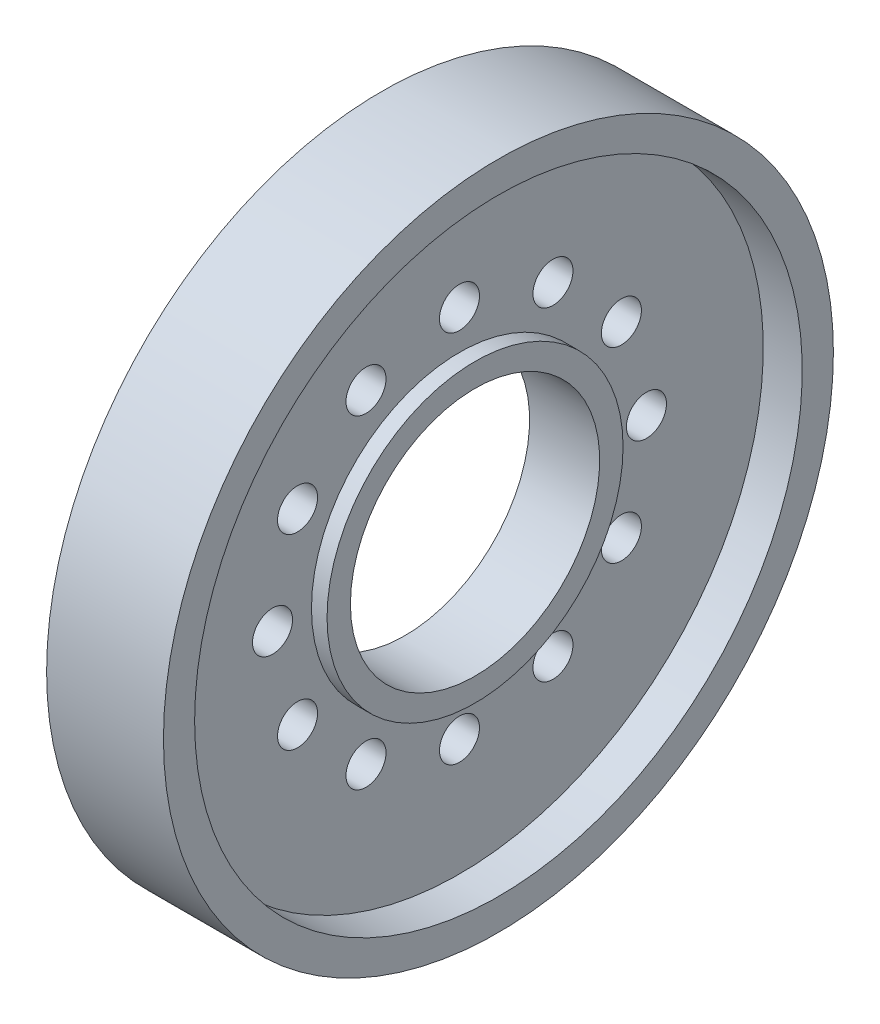
ISO-10303-21;
HEADER;
FILE_DESCRIPTION(('STEP AP214'),'2;1');
FILE_NAME('part.step','',(''),(''),'','','');
FILE_SCHEMA(('AUTOMOTIVE_DESIGN { 1 0 10303 214 1 1 1 1 }'));
ENDSEC;
DATA;
#1=APPLICATION_CONTEXT('core data for automotive mechanical design processes');
#2=APPLICATION_PROTOCOL_DEFINITION('international standard','automotive_design',2000,#1);
#3=PRODUCT_CONTEXT('',#1,'mechanical');
#4=PRODUCT('Part','Part','',(#3));
#5=PRODUCT_RELATED_PRODUCT_CATEGORY('part','',(#4));
#6=PRODUCT_DEFINITION_FORMATION('','',#4);
#7=PRODUCT_DEFINITION_CONTEXT('part definition',#1,'design');
#8=PRODUCT_DEFINITION('design','',#6,#7);
#9=PRODUCT_DEFINITION_SHAPE('','',#8);
#10=(LENGTH_UNIT() NAMED_UNIT(*) SI_UNIT(.MILLI.,.METRE.));
#11=(NAMED_UNIT(*) PLANE_ANGLE_UNIT() SI_UNIT($,.RADIAN.));
#12=(NAMED_UNIT(*) SI_UNIT($,.STERADIAN.) SOLID_ANGLE_UNIT());
#13=UNCERTAINTY_MEASURE_WITH_UNIT(LENGTH_MEASURE(1.E-05),#10,'distance_accuracy_value','');
#14=(GEOMETRIC_REPRESENTATION_CONTEXT(3) GLOBAL_UNCERTAINTY_ASSIGNED_CONTEXT((#13)) GLOBAL_UNIT_ASSIGNED_CONTEXT((#10,
#11,#12)) REPRESENTATION_CONTEXT('',''));
#15=CARTESIAN_POINT('',(0.,0.,0.));
#16=DIRECTION('',(0.,0.,1.));
#17=DIRECTION('',(1.,0.,0.));
#18=AXIS2_PLACEMENT_3D('',#15,#16,#17);
#19=CARTESIAN_POINT('',(-9.525,49.53,0.));
#20=DIRECTION('',(1.,0.,0.));
#21=DIRECTION('',(0.,0.,-1.));
#22=AXIS2_PLACEMENT_3D('',#19,#20,#21);
#23=PLANE('',#22);
#24=CARTESIAN_POINT('',(-9.525,0.,0.));
#25=DIRECTION('',(-1.,0.,0.));
#26=DIRECTION('',(0.,0.,1.));
#27=AXIS2_PLACEMENT_3D('',#24,#25,#26);
#28=CIRCLE('',#27,49.53);
#29=CARTESIAN_POINT('',(-9.525,0.,49.53));
#30=VERTEX_POINT('',#29);
#31=EDGE_CURVE('E62',#30,#30,#28,.T.);
#32=ORIENTED_EDGE('',*,*,#31,.F.);
#33=EDGE_LOOP('',(#32));
#34=FACE_BOUND('',#33,.T.);
#35=CARTESIAN_POINT('',(-9.525,0.,0.));
#36=DIRECTION('',(-1.,0.,0.));
#37=DIRECTION('',(0.,0.,1.));
#38=AXIS2_PLACEMENT_3D('',#35,#36,#37);
#39=CIRCLE('',#38,54.61);
#40=CARTESIAN_POINT('',(-9.525,0.,54.61));
#41=VERTEX_POINT('',#40);
#42=EDGE_CURVE('E10',#41,#41,#39,.T.);
#43=ORIENTED_EDGE('',*,*,#42,.T.);
#44=EDGE_LOOP('',(#43));
#45=FACE_BOUND('',#44,.T.);
#46=ADVANCED_FACE('F40',(#34,#45),#23,.F.);
#47=CARTESIAN_POINT('',(-31.2933707865168,0.,0.));
#48=DIRECTION('',(-1.,0.,0.));
#49=DIRECTION('',(0.,0.,1.));
#50=AXIS2_PLACEMENT_3D('',#47,#48,#49);
#51=CYLINDRICAL_SURFACE('',#50,54.61);
#52=ORIENTED_EDGE('',*,*,#42,.F.);
#53=EDGE_LOOP('',(#52));
#54=FACE_BOUND('',#53,.T.);
#55=CARTESIAN_POINT('',(9.525,0.,0.));
#56=DIRECTION('',(-1.,0.,0.));
#57=DIRECTION('',(0.,0.,1.));
#58=AXIS2_PLACEMENT_3D('',#55,#56,#57);
#59=CIRCLE('',#58,54.61);
#60=CARTESIAN_POINT('',(9.525,0.,54.61));
#61=VERTEX_POINT('',#60);
#62=EDGE_CURVE('E48',#61,#61,#59,.T.);
#63=ORIENTED_EDGE('',*,*,#62,.T.);
#64=EDGE_LOOP('',(#63));
#65=FACE_BOUND('',#64,.T.);
#66=ADVANCED_FACE('F214',(#54,#65),#51,.T.);
#67=CARTESIAN_POINT('',(9.525,54.61,0.));
#68=DIRECTION('',(-1.,0.,0.));
#69=DIRECTION('',(0.,0.,1.));
#70=AXIS2_PLACEMENT_3D('',#67,#68,#69);
#71=PLANE('',#70);
#72=ORIENTED_EDGE('',*,*,#62,.F.);
#73=EDGE_LOOP('',(#72));
#74=FACE_BOUND('',#73,.T.);
#75=CARTESIAN_POINT('',(9.525,0.,0.));
#76=DIRECTION('',(-1.,0.,0.));
#77=DIRECTION('',(0.,0.,1.));
#78=AXIS2_PLACEMENT_3D('',#75,#76,#77);
#79=CIRCLE('',#78,49.53);
#80=CARTESIAN_POINT('',(9.525,0.,49.53));
#81=VERTEX_POINT('',#80);
#82=EDGE_CURVE('E54',#81,#81,#79,.T.);
#83=ORIENTED_EDGE('',*,*,#82,.T.);
#84=EDGE_LOOP('',(#83));
#85=FACE_BOUND('',#84,.T.);
#86=ADVANCED_FACE('F155',(#74,#85),#71,.F.);
#87=CARTESIAN_POINT('',(-31.2933707865168,0.,0.));
#88=DIRECTION('',(-1.,0.,0.));
#89=DIRECTION('',(0.,0.,1.));
#90=AXIS2_PLACEMENT_3D('',#87,#88,#89);
#91=CYLINDRICAL_SURFACE('',#90,49.53);
#92=ORIENTED_EDGE('',*,*,#82,.F.);
#93=EDGE_LOOP('',(#92));
#94=FACE_BOUND('',#93,.T.);
#95=CARTESIAN_POINT('',(3.175,0.,0.));
#96=DIRECTION('',(-1.,0.,0.));
#97=DIRECTION('',(0.,0.,1.));
#98=AXIS2_PLACEMENT_3D('',#95,#96,#97);
#99=CIRCLE('',#98,49.53);
#100=CARTESIAN_POINT('',(3.175,0.,49.53));
#101=VERTEX_POINT('',#100);
#102=EDGE_CURVE('E148',#101,#101,#99,.T.);
#103=ORIENTED_EDGE('',*,*,#102,.T.);
#104=EDGE_LOOP('',(#103));
#105=FACE_BOUND('',#104,.T.);
#106=ADVANCED_FACE('F157',(#94,#105),#91,.F.);
#107=CARTESIAN_POINT('',(3.175,49.53,0.));
#108=DIRECTION('',(-1.,0.,0.));
#109=DIRECTION('',(0.,0.,1.));
#110=AXIS2_PLACEMENT_3D('',#107,#108,#109);
#111=PLANE('',#110);
#112=CARTESIAN_POINT('',(3.175,15.2399999999999,-26.3964543073497));
#113=DIRECTION('',(1.,0.,0.));
#114=DIRECTION('',(0.,-0.86602540378444,-0.499999999999998));
#115=AXIS2_PLACEMENT_3D('',#112,#113,#114);
#116=CIRCLE('',#115,3.2639);
#117=CARTESIAN_POINT('',(3.175,12.4133796845879,-28.0284043073497));
#118=VERTEX_POINT('',#117);
#119=EDGE_CURVE('E300',#118,#118,#116,.T.);
#120=ORIENTED_EDGE('',*,*,#119,.F.);
#121=EDGE_LOOP('',(#120));
#122=FACE_BOUND('',#121,.T.);
#123=CARTESIAN_POINT('',(3.175,-1.06420351207939E-13,-30.48));
#124=DIRECTION('',(1.,0.,0.));
#125=DIRECTION('',(0.,-1.,0.));
#126=AXIS2_PLACEMENT_3D('',#123,#124,#125);
#127=CIRCLE('',#126,3.2639);
#128=CARTESIAN_POINT('',(3.175,-3.26390000000011,-30.48));
#129=VERTEX_POINT('',#128);
#130=EDGE_CURVE('E304',#129,#129,#127,.T.);
#131=ORIENTED_EDGE('',*,*,#130,.F.);
#132=EDGE_LOOP('',(#131));
#133=FACE_BOUND('',#132,.T.);
#134=CARTESIAN_POINT('',(3.175,-15.2400000000001,-26.3964543073496));
#135=DIRECTION('',(1.,0.,0.));
#136=DIRECTION('',(0.,-0.866025403784436,0.500000000000004));
#137=AXIS2_PLACEMENT_3D('',#134,#135,#136);
#138=CIRCLE('',#137,3.2639);
#139=CARTESIAN_POINT('',(3.175,-18.0666203154121,-24.7645043073496));
#140=VERTEX_POINT('',#139);
#141=EDGE_CURVE('E308',#140,#140,#138,.T.);
#142=ORIENTED_EDGE('',*,*,#141,.F.);
#143=EDGE_LOOP('',(#142));
#144=FACE_BOUND('',#143,.T.);
#145=CARTESIAN_POINT('',(3.175,-26.3964543073498,-15.2399999999998));
#146=DIRECTION('',(1.,0.,0.));
#147=DIRECTION('',(0.,-0.499999999999995,0.866025403784442));
#148=AXIS2_PLACEMENT_3D('',#145,#146,#147);
#149=CIRCLE('',#148,3.2639);
#150=CARTESIAN_POINT('',(3.175,-28.0284043073498,-12.4133796845878));
#151=VERTEX_POINT('',#150);
#152=EDGE_CURVE('E312',#151,#151,#149,.T.);
#153=ORIENTED_EDGE('',*,*,#152,.F.);
#154=EDGE_LOOP('',(#153));
#155=FACE_BOUND('',#154,.T.);
#156=CARTESIAN_POINT('',(3.175,-30.48,0.));
#157=DIRECTION('',(1.,0.,0.));
#158=DIRECTION('',(0.,0.,1.));
#159=AXIS2_PLACEMENT_3D('',#156,#157,#158);
#160=CIRCLE('',#159,3.2639);
#161=CARTESIAN_POINT('',(3.175,-30.48,3.2639));
#162=VERTEX_POINT('',#161);
#163=EDGE_CURVE('E316',#162,#162,#160,.T.);
#164=ORIENTED_EDGE('',*,*,#163,.F.);
#165=EDGE_LOOP('',(#164));
#166=FACE_BOUND('',#165,.T.);
#167=CARTESIAN_POINT('',(3.175,-26.3964543073496,15.2400000000002));
#168=DIRECTION('',(1.,0.,0.));
#169=DIRECTION('',(0.,0.500000000000007,0.866025403784435));
#170=AXIS2_PLACEMENT_3D('',#167,#168,#169);
#171=CIRCLE('',#170,3.2639);
#172=CARTESIAN_POINT('',(3.175,-24.7645043073495,18.0666203154122));
#173=VERTEX_POINT('',#172);
#174=EDGE_CURVE('E320',#173,#173,#171,.T.);
#175=ORIENTED_EDGE('',*,*,#174,.F.);
#176=EDGE_LOOP('',(#175));
#177=FACE_BOUND('',#176,.T.);
#178=CARTESIAN_POINT('',(3.175,-15.2399999999998,26.3964543073498));
#179=DIRECTION('',(1.,0.,0.));
#180=DIRECTION('',(0.,0.866025403784443,0.499999999999992));
#181=AXIS2_PLACEMENT_3D('',#178,#179,#180);
#182=CIRCLE('',#181,3.2639);
#183=CARTESIAN_POINT('',(3.175,-12.4133796845877,28.0284043073498));
#184=VERTEX_POINT('',#183);
#185=EDGE_CURVE('E296',#184,#184,#182,.T.);
#186=ORIENTED_EDGE('',*,*,#185,.F.);
#187=EDGE_LOOP('',(#186));
#188=FACE_BOUND('',#187,.T.);
#189=CARTESIAN_POINT('',(3.175,3.19261053623816E-13,30.48));
#190=DIRECTION('',(1.,0.,0.));
#191=DIRECTION('',(0.,1.,0.));
#192=AXIS2_PLACEMENT_3D('',#189,#190,#191);
#193=CIRCLE('',#192,3.2639);
#194=CARTESIAN_POINT('',(3.175,3.26390000000032,30.48));
#195=VERTEX_POINT('',#194);
#196=EDGE_CURVE('E290',#195,#195,#193,.T.);
#197=ORIENTED_EDGE('',*,*,#196,.F.);
#198=EDGE_LOOP('',(#197));
#199=FACE_BOUND('',#198,.T.);
#200=CARTESIAN_POINT('',(3.175,15.2400000000003,26.3964543073495));
#201=DIRECTION('',(1.,0.,0.));
#202=DIRECTION('',(0.,0.866025403784433,-0.50000000000001));
#203=AXIS2_PLACEMENT_3D('',#200,#201,#202);
#204=CIRCLE('',#203,3.2639);
#205=CARTESIAN_POINT('',(3.175,18.0666203154123,24.7645043073495));
#206=VERTEX_POINT('',#205);
#207=EDGE_CURVE('E276',#206,#206,#204,.T.);
#208=ORIENTED_EDGE('',*,*,#207,.F.);
#209=EDGE_LOOP('',(#208));
#210=FACE_BOUND('',#209,.T.);
#211=CARTESIAN_POINT('',(3.175,26.3964543073499,15.2399999999997));
#212=DIRECTION('',(1.,0.,0.));
#213=DIRECTION('',(0.,0.499999999999989,-0.866025403784445));
#214=AXIS2_PLACEMENT_3D('',#211,#212,#213);
#215=CIRCLE('',#214,3.2639);
#216=CARTESIAN_POINT('',(3.175,28.0284043073498,12.4133796845876));
#217=VERTEX_POINT('',#216);
#218=EDGE_CURVE('E291',#217,#217,#215,.T.);
#219=ORIENTED_EDGE('',*,*,#218,.F.);
#220=EDGE_LOOP('',(#219));
#221=FACE_BOUND('',#220,.T.);
#222=CARTESIAN_POINT('',(3.175,26.3964543073497,-15.24));
#223=DIRECTION('',(1.,0.,0.));
#224=DIRECTION('',(0.,-0.500000000000001,-0.866025403784438));
#225=AXIS2_PLACEMENT_3D('',#222,#223,#224);
#226=CIRCLE('',#225,3.2639);
#227=CARTESIAN_POINT('',(3.175,24.7645043073497,-18.0666203154121));
#228=VERTEX_POINT('',#227);
#229=EDGE_CURVE('E69',#228,#228,#226,.T.);
#230=ORIENTED_EDGE('',*,*,#229,.F.);
#231=EDGE_LOOP('',(#230));
#232=FACE_BOUND('',#231,.T.);
#233=CARTESIAN_POINT('',(3.175,30.48,0.));
#234=DIRECTION('',(1.,0.,0.));
#235=DIRECTION('',(0.,0.,-1.));
#236=AXIS2_PLACEMENT_3D('',#233,#234,#235);
#237=CIRCLE('',#236,3.2639);
#238=CARTESIAN_POINT('',(3.175,30.48,-3.2639));
#239=VERTEX_POINT('',#238);
#240=EDGE_CURVE('E63',#239,#239,#237,.T.);
#241=ORIENTED_EDGE('',*,*,#240,.F.);
#242=EDGE_LOOP('',(#241));
#243=FACE_BOUND('',#242,.T.);
#244=ORIENTED_EDGE('',*,*,#102,.F.);
#245=EDGE_LOOP('',(#244));
#246=FACE_BOUND('',#245,.T.);
#247=CARTESIAN_POINT('',(3.175,0.,0.));
#248=DIRECTION('',(-1.,0.,0.));
#249=DIRECTION('',(0.,0.,1.));
#250=AXIS2_PLACEMENT_3D('',#247,#248,#249);
#251=CIRCLE('',#250,24.13);
#252=CARTESIAN_POINT('',(3.175,0.,24.13));
#253=VERTEX_POINT('',#252);
#254=EDGE_CURVE('E144',#253,#253,#251,.T.);
#255=ORIENTED_EDGE('',*,*,#254,.T.);
#256=EDGE_LOOP('',(#255));
#257=FACE_BOUND('',#256,.T.);
#258=ADVANCED_FACE('F160',(#122,#133,#144,#155,#166,#177,#188,#199,#210,#221,#232,#243,#246,
#257),#111,.F.);
#259=CARTESIAN_POINT('',(-31.2933707865168,0.,0.));
#260=DIRECTION('',(-1.,0.,0.));
#261=DIRECTION('',(0.,0.,1.));
#262=AXIS2_PLACEMENT_3D('',#259,#260,#261);
#263=CYLINDRICAL_SURFACE('',#262,24.13);
#264=ORIENTED_EDGE('',*,*,#254,.F.);
#265=EDGE_LOOP('',(#264));
#266=FACE_BOUND('',#265,.T.);
#267=CARTESIAN_POINT('',(5.715,0.,0.));
#268=DIRECTION('',(-1.,0.,0.));
#269=DIRECTION('',(0.,0.,1.));
#270=AXIS2_PLACEMENT_3D('',#267,#268,#269);
#271=CIRCLE('',#270,24.13);
#272=CARTESIAN_POINT('',(5.715,0.,24.13));
#273=VERTEX_POINT('',#272);
#274=EDGE_CURVE('E140',#273,#273,#271,.T.);
#275=ORIENTED_EDGE('',*,*,#274,.T.);
#276=EDGE_LOOP('',(#275));
#277=FACE_BOUND('',#276,.T.);
#278=ADVANCED_FACE('F166',(#266,#277),#263,.T.);
#279=CARTESIAN_POINT('',(5.715,20.32,0.));
#280=DIRECTION('',(-1.,0.,0.));
#281=DIRECTION('',(0.,0.,1.));
#282=AXIS2_PLACEMENT_3D('',#279,#280,#281);
#283=PLANE('',#282);
#284=ORIENTED_EDGE('',*,*,#274,.F.);
#285=EDGE_LOOP('',(#284));
#286=FACE_BOUND('',#285,.T.);
#287=CARTESIAN_POINT('',(5.715,0.,0.));
#288=DIRECTION('',(-1.,0.,0.));
#289=DIRECTION('',(0.,0.,1.));
#290=AXIS2_PLACEMENT_3D('',#287,#288,#289);
#291=CIRCLE('',#290,20.32);
#292=CARTESIAN_POINT('',(5.715,0.,20.32));
#293=VERTEX_POINT('',#292);
#294=EDGE_CURVE('E136',#293,#293,#291,.T.);
#295=ORIENTED_EDGE('',*,*,#294,.T.);
#296=EDGE_LOOP('',(#295));
#297=FACE_BOUND('',#296,.T.);
#298=ADVANCED_FACE('F173',(#286,#297),#283,.F.);
#299=CARTESIAN_POINT('',(-31.2933707865168,0.,0.));
#300=DIRECTION('',(-1.,0.,0.));
#301=DIRECTION('',(0.,0.,1.));
#302=AXIS2_PLACEMENT_3D('',#299,#300,#301);
#303=CYLINDRICAL_SURFACE('',#302,20.32);
#304=ORIENTED_EDGE('',*,*,#294,.F.);
#305=EDGE_LOOP('',(#304));
#306=FACE_BOUND('',#305,.T.);
#307=CARTESIAN_POINT('',(-5.715,0.,0.));
#308=DIRECTION('',(-1.,0.,0.));
#309=DIRECTION('',(0.,0.,1.));
#310=AXIS2_PLACEMENT_3D('',#307,#308,#309);
#311=CIRCLE('',#310,20.32);
#312=CARTESIAN_POINT('',(-5.715,0.,20.32));
#313=VERTEX_POINT('',#312);
#314=EDGE_CURVE('E132',#313,#313,#311,.T.);
#315=ORIENTED_EDGE('',*,*,#314,.T.);
#316=EDGE_LOOP('',(#315));
#317=FACE_BOUND('',#316,.T.);
#318=ADVANCED_FACE('F179',(#306,#317),#303,.F.);
#319=CARTESIAN_POINT('',(-5.715,24.13,0.));
#320=DIRECTION('',(1.,0.,0.));
#321=DIRECTION('',(0.,0.,-1.));
#322=AXIS2_PLACEMENT_3D('',#319,#320,#321);
#323=PLANE('',#322);
#324=ORIENTED_EDGE('',*,*,#314,.F.);
#325=EDGE_LOOP('',(#324));
#326=FACE_BOUND('',#325,.T.);
#327=CARTESIAN_POINT('',(-5.715,0.,0.));
#328=DIRECTION('',(-1.,0.,0.));
#329=DIRECTION('',(0.,0.,1.));
#330=AXIS2_PLACEMENT_3D('',#327,#328,#329);
#331=CIRCLE('',#330,24.13);
#332=CARTESIAN_POINT('',(-5.715,0.,24.13));
#333=VERTEX_POINT('',#332);
#334=EDGE_CURVE('E128',#333,#333,#331,.T.);
#335=ORIENTED_EDGE('',*,*,#334,.T.);
#336=EDGE_LOOP('',(#335));
#337=FACE_BOUND('',#336,.T.);
#338=ADVANCED_FACE('F185',(#326,#337),#323,.F.);
#339=CARTESIAN_POINT('',(-31.2933707865168,0.,0.));
#340=DIRECTION('',(-1.,0.,0.));
#341=DIRECTION('',(0.,0.,1.));
#342=AXIS2_PLACEMENT_3D('',#339,#340,#341);
#343=CYLINDRICAL_SURFACE('',#342,24.13);
#344=ORIENTED_EDGE('',*,*,#334,.F.);
#345=EDGE_LOOP('',(#344));
#346=FACE_BOUND('',#345,.T.);
#347=CARTESIAN_POINT('',(-3.175,0.,0.));
#348=DIRECTION('',(-1.,0.,0.));
#349=DIRECTION('',(0.,0.,1.));
#350=AXIS2_PLACEMENT_3D('',#347,#348,#349);
#351=CIRCLE('',#350,24.13);
#352=CARTESIAN_POINT('',(-3.175,0.,24.13));
#353=VERTEX_POINT('',#352);
#354=EDGE_CURVE('E124',#353,#353,#351,.T.);
#355=ORIENTED_EDGE('',*,*,#354,.T.);
#356=EDGE_LOOP('',(#355));
#357=FACE_BOUND('',#356,.T.);
#358=ADVANCED_FACE('F191',(#346,#357),#343,.T.);
#359=CARTESIAN_POINT('',(-3.175,24.13,0.));
#360=DIRECTION('',(1.,0.,0.));
#361=DIRECTION('',(0.,0.,-1.));
#362=AXIS2_PLACEMENT_3D('',#359,#360,#361);
#363=PLANE('',#362);
#364=CARTESIAN_POINT('',(-3.175,15.2399999999999,-26.3964543073497));
#365=DIRECTION('',(1.,0.,0.));
#366=DIRECTION('',(0.,0.,-1.));
#367=AXIS2_PLACEMENT_3D('',#364,#365,#366);
#368=CIRCLE('',#367,3.2639);
#369=CARTESIAN_POINT('',(-3.175,15.2399999999999,-29.6603543073497));
#370=VERTEX_POINT('',#369);
#371=EDGE_CURVE('E43',#370,#370,#368,.T.);
#372=ORIENTED_EDGE('',*,*,#371,.T.);
#373=EDGE_LOOP('',(#372));
#374=FACE_BOUND('',#373,.T.);
#375=CARTESIAN_POINT('',(-3.175,-1.06420351207939E-13,-30.48));
#376=DIRECTION('',(1.,0.,0.));
#377=DIRECTION('',(0.,0.,-1.));
#378=AXIS2_PLACEMENT_3D('',#375,#376,#377);
#379=CIRCLE('',#378,3.2639);
#380=CARTESIAN_POINT('',(-3.175,-1.06420351207939E-13,-33.7439));
#381=VERTEX_POINT('',#380);
#382=EDGE_CURVE('E100',#381,#381,#379,.T.);
#383=ORIENTED_EDGE('',*,*,#382,.T.);
#384=EDGE_LOOP('',(#383));
#385=FACE_BOUND('',#384,.T.);
#386=CARTESIAN_POINT('',(-3.175,-15.2400000000001,-26.3964543073496));
#387=DIRECTION('',(1.,0.,0.));
#388=DIRECTION('',(0.,0.,-1.));
#389=AXIS2_PLACEMENT_3D('',#386,#387,#388);
#390=CIRCLE('',#389,3.2639);
#391=CARTESIAN_POINT('',(-3.175,-15.2400000000001,-29.6603543073496));
#392=VERTEX_POINT('',#391);
#393=EDGE_CURVE('E97',#392,#392,#390,.T.);
#394=ORIENTED_EDGE('',*,*,#393,.T.);
#395=EDGE_LOOP('',(#394));
#396=FACE_BOUND('',#395,.T.);
#397=CARTESIAN_POINT('',(-3.175,-26.3964543073498,-15.2399999999998));
#398=DIRECTION('',(1.,0.,0.));
#399=DIRECTION('',(0.,0.,-1.));
#400=AXIS2_PLACEMENT_3D('',#397,#398,#399);
#401=CIRCLE('',#400,3.2639);
#402=CARTESIAN_POINT('',(-3.175,-26.3964543073498,-18.5038999999998));
#403=VERTEX_POINT('',#402);
#404=EDGE_CURVE('E93',#403,#403,#401,.T.);
#405=ORIENTED_EDGE('',*,*,#404,.T.);
#406=EDGE_LOOP('',(#405));
#407=FACE_BOUND('',#406,.T.);
#408=CARTESIAN_POINT('',(-3.175,-30.48,0.));
#409=DIRECTION('',(1.,0.,0.));
#410=DIRECTION('',(0.,0.,-1.));
#411=AXIS2_PLACEMENT_3D('',#408,#409,#410);
#412=CIRCLE('',#411,3.2639);
#413=CARTESIAN_POINT('',(-3.175,-30.48,-3.2639));
#414=VERTEX_POINT('',#413);
#415=EDGE_CURVE('E89',#414,#414,#412,.T.);
#416=ORIENTED_EDGE('',*,*,#415,.T.);
#417=EDGE_LOOP('',(#416));
#418=FACE_BOUND('',#417,.T.);
#419=CARTESIAN_POINT('',(-3.175,-26.3964543073496,15.2400000000002));
#420=DIRECTION('',(1.,0.,0.));
#421=DIRECTION('',(0.,0.,-1.));
#422=AXIS2_PLACEMENT_3D('',#419,#420,#421);
#423=CIRCLE('',#422,3.2639);
#424=CARTESIAN_POINT('',(-3.175,-26.3964543073496,11.9761000000002));
#425=VERTEX_POINT('',#424);
#426=EDGE_CURVE('E85',#425,#425,#423,.T.);
#427=ORIENTED_EDGE('',*,*,#426,.T.);
#428=EDGE_LOOP('',(#427));
#429=FACE_BOUND('',#428,.T.);
#430=CARTESIAN_POINT('',(-3.175,-15.2399999999998,26.3964543073498));
#431=DIRECTION('',(1.,0.,0.));
#432=DIRECTION('',(0.,0.,-1.));
#433=AXIS2_PLACEMENT_3D('',#430,#431,#432);
#434=CIRCLE('',#433,3.2639);
#435=CARTESIAN_POINT('',(-3.175,-15.2399999999998,23.1325543073498));
#436=VERTEX_POINT('',#435);
#437=EDGE_CURVE('E81',#436,#436,#434,.T.);
#438=ORIENTED_EDGE('',*,*,#437,.T.);
#439=EDGE_LOOP('',(#438));
#440=FACE_BOUND('',#439,.T.);
#441=CARTESIAN_POINT('',(-3.175,3.19261053623816E-13,30.48));
#442=DIRECTION('',(1.,0.,0.));
#443=DIRECTION('',(0.,0.,-1.));
#444=AXIS2_PLACEMENT_3D('',#441,#442,#443);
#445=CIRCLE('',#444,3.2639);
#446=CARTESIAN_POINT('',(-3.175,3.19261053623816E-13,27.2161));
#447=VERTEX_POINT('',#446);
#448=EDGE_CURVE('E77',#447,#447,#445,.T.);
#449=ORIENTED_EDGE('',*,*,#448,.T.);
#450=EDGE_LOOP('',(#449));
#451=FACE_BOUND('',#450,.T.);
#452=CARTESIAN_POINT('',(-3.175,15.2400000000003,26.3964543073495));
#453=DIRECTION('',(1.,0.,0.));
#454=DIRECTION('',(0.,0.,-1.));
#455=AXIS2_PLACEMENT_3D('',#452,#453,#454);
#456=CIRCLE('',#455,3.2639);
#457=CARTESIAN_POINT('',(-3.175,15.2400000000003,23.1325543073495));
#458=VERTEX_POINT('',#457);
#459=EDGE_CURVE('E73',#458,#458,#456,.T.);
#460=ORIENTED_EDGE('',*,*,#459,.T.);
#461=EDGE_LOOP('',(#460));
#462=FACE_BOUND('',#461,.T.);
#463=CARTESIAN_POINT('',(-3.175,26.3964543073499,15.2399999999997));
#464=DIRECTION('',(1.,0.,0.));
#465=DIRECTION('',(0.,0.,-1.));
#466=AXIS2_PLACEMENT_3D('',#463,#464,#465);
#467=CIRCLE('',#466,3.2639);
#468=CARTESIAN_POINT('',(-3.175,26.3964543073499,11.9760999999997));
#469=VERTEX_POINT('',#468);
#470=EDGE_CURVE('E68',#469,#469,#467,.T.);
#471=ORIENTED_EDGE('',*,*,#470,.T.);
#472=EDGE_LOOP('',(#471));
#473=FACE_BOUND('',#472,.T.);
#474=CARTESIAN_POINT('',(-3.175,26.3964543073497,-15.24));
#475=DIRECTION('',(1.,0.,0.));
#476=DIRECTION('',(0.,0.,-1.));
#477=AXIS2_PLACEMENT_3D('',#474,#475,#476);
#478=CIRCLE('',#477,3.2639);
#479=CARTESIAN_POINT('',(-3.175,26.3964543073497,-18.5039));
#480=VERTEX_POINT('',#479);
#481=EDGE_CURVE('E64',#480,#480,#478,.T.);
#482=ORIENTED_EDGE('',*,*,#481,.T.);
#483=EDGE_LOOP('',(#482));
#484=FACE_BOUND('',#483,.T.);
#485=CARTESIAN_POINT('',(-3.175,30.48,0.));
#486=DIRECTION('',(1.,0.,0.));
#487=DIRECTION('',(0.,0.,-1.));
#488=AXIS2_PLACEMENT_3D('',#485,#486,#487);
#489=CIRCLE('',#488,3.2639);
#490=CARTESIAN_POINT('',(-3.175,30.48,-3.2639));
#491=VERTEX_POINT('',#490);
#492=EDGE_CURVE('E58',#491,#491,#489,.T.);
#493=ORIENTED_EDGE('',*,*,#492,.T.);
#494=EDGE_LOOP('',(#493));
#495=FACE_BOUND('',#494,.T.);
#496=ORIENTED_EDGE('',*,*,#354,.F.);
#497=EDGE_LOOP('',(#496));
#498=FACE_BOUND('',#497,.T.);
#499=CARTESIAN_POINT('',(-3.175,0.,0.));
#500=DIRECTION('',(-1.,0.,0.));
#501=DIRECTION('',(0.,0.,1.));
#502=AXIS2_PLACEMENT_3D('',#499,#500,#501);
#503=CIRCLE('',#502,49.53);
#504=CARTESIAN_POINT('',(-3.175,0.,49.53));
#505=VERTEX_POINT('',#504);
#506=EDGE_CURVE('E120',#505,#505,#503,.T.);
#507=ORIENTED_EDGE('',*,*,#506,.T.);
#508=EDGE_LOOP('',(#507));
#509=FACE_BOUND('',#508,.T.);
#510=ADVANCED_FACE('F197',(#374,#385,#396,#407,#418,#429,#440,#451,#462,#473,#484,#495,#498,
#509),#363,.F.);
#511=CARTESIAN_POINT('',(-31.2933707865168,0.,0.));
#512=DIRECTION('',(-1.,0.,0.));
#513=DIRECTION('',(0.,0.,1.));
#514=AXIS2_PLACEMENT_3D('',#511,#512,#513);
#515=CYLINDRICAL_SURFACE('',#514,49.53);
#516=ORIENTED_EDGE('',*,*,#506,.F.);
#517=EDGE_LOOP('',(#516));
#518=FACE_BOUND('',#517,.T.);
#519=ORIENTED_EDGE('',*,*,#31,.T.);
#520=EDGE_LOOP('',(#519));
#521=FACE_BOUND('',#520,.T.);
#522=ADVANCED_FACE('F203',(#518,#521),#515,.F.);
#523=CARTESIAN_POINT('',(-9.525,30.48,0.));
#524=DIRECTION('',(1.,0.,0.));
#525=DIRECTION('',(0.,0.,-1.));
#526=AXIS2_PLACEMENT_3D('',#523,#524,#525);
#527=CYLINDRICAL_SURFACE('',#526,3.2639);
#528=ORIENTED_EDGE('',*,*,#240,.T.);
#529=EDGE_LOOP('',(#528));
#530=FACE_BOUND('',#529,.T.);
#531=ORIENTED_EDGE('',*,*,#492,.F.);
#532=EDGE_LOOP('',(#531));
#533=FACE_BOUND('',#532,.T.);
#534=ADVANCED_FACE('F209',(#530,#533),#527,.F.);
#535=CARTESIAN_POINT('',(-9.525,26.3964543073497,-15.24));
#536=DIRECTION('',(1.,0.,0.));
#537=DIRECTION('',(0.,0.,-1.));
#538=AXIS2_PLACEMENT_3D('',#535,#536,#537);
#539=CYLINDRICAL_SURFACE('',#538,3.2639);
#540=ORIENTED_EDGE('',*,*,#229,.T.);
#541=EDGE_LOOP('',(#540));
#542=FACE_BOUND('',#541,.T.);
#543=ORIENTED_EDGE('',*,*,#481,.F.);
#544=EDGE_LOOP('',(#543));
#545=FACE_BOUND('',#544,.T.);
#546=ADVANCED_FACE('F228',(#542,#545),#539,.F.);
#547=CARTESIAN_POINT('',(-9.525,26.3964543073499,15.2399999999997));
#548=DIRECTION('',(1.,0.,0.));
#549=DIRECTION('',(0.,0.,-1.));
#550=AXIS2_PLACEMENT_3D('',#547,#548,#549);
#551=CYLINDRICAL_SURFACE('',#550,3.2639);
#552=ORIENTED_EDGE('',*,*,#218,.T.);
#553=EDGE_LOOP('',(#552));
#554=FACE_BOUND('',#553,.T.);
#555=ORIENTED_EDGE('',*,*,#470,.F.);
#556=EDGE_LOOP('',(#555));
#557=FACE_BOUND('',#556,.T.);
#558=ADVANCED_FACE('F231',(#554,#557),#551,.F.);
#559=CARTESIAN_POINT('',(-9.525,15.2400000000003,26.3964543073495));
#560=DIRECTION('',(1.,0.,0.));
#561=DIRECTION('',(0.,0.,-1.));
#562=AXIS2_PLACEMENT_3D('',#559,#560,#561);
#563=CYLINDRICAL_SURFACE('',#562,3.2639);
#564=ORIENTED_EDGE('',*,*,#207,.T.);
#565=EDGE_LOOP('',(#564));
#566=FACE_BOUND('',#565,.T.);
#567=ORIENTED_EDGE('',*,*,#459,.F.);
#568=EDGE_LOOP('',(#567));
#569=FACE_BOUND('',#568,.T.);
#570=ADVANCED_FACE('F237',(#566,#569),#563,.F.);
#571=CARTESIAN_POINT('',(-9.525,3.19261053623816E-13,30.48));
#572=DIRECTION('',(1.,0.,0.));
#573=DIRECTION('',(0.,0.,-1.));
#574=AXIS2_PLACEMENT_3D('',#571,#572,#573);
#575=CYLINDRICAL_SURFACE('',#574,3.2639);
#576=ORIENTED_EDGE('',*,*,#196,.T.);
#577=EDGE_LOOP('',(#576));
#578=FACE_BOUND('',#577,.T.);
#579=ORIENTED_EDGE('',*,*,#448,.F.);
#580=EDGE_LOOP('',(#579));
#581=FACE_BOUND('',#580,.T.);
#582=ADVANCED_FACE('F233',(#578,#581),#575,.F.);
#583=CARTESIAN_POINT('',(-9.525,-15.2399999999998,26.3964543073498));
#584=DIRECTION('',(1.,0.,0.));
#585=DIRECTION('',(0.,0.,-1.));
#586=AXIS2_PLACEMENT_3D('',#583,#584,#585);
#587=CYLINDRICAL_SURFACE('',#586,3.2639);
#588=ORIENTED_EDGE('',*,*,#185,.T.);
#589=EDGE_LOOP('',(#588));
#590=FACE_BOUND('',#589,.T.);
#591=ORIENTED_EDGE('',*,*,#437,.F.);
#592=EDGE_LOOP('',(#591));
#593=FACE_BOUND('',#592,.T.);
#594=ADVANCED_FACE('F236',(#590,#593),#587,.F.);
#595=CARTESIAN_POINT('',(-9.525,-26.3964543073496,15.2400000000002));
#596=DIRECTION('',(1.,0.,0.));
#597=DIRECTION('',(0.,0.,-1.));
#598=AXIS2_PLACEMENT_3D('',#595,#596,#597);
#599=CYLINDRICAL_SURFACE('',#598,3.2639);
#600=ORIENTED_EDGE('',*,*,#174,.T.);
#601=EDGE_LOOP('',(#600));
#602=FACE_BOUND('',#601,.T.);
#603=ORIENTED_EDGE('',*,*,#426,.F.);
#604=EDGE_LOOP('',(#603));
#605=FACE_BOUND('',#604,.T.);
#606=ADVANCED_FACE('F241',(#602,#605),#599,.F.);
#607=CARTESIAN_POINT('',(-9.525,-30.48,0.));
#608=DIRECTION('',(1.,0.,0.));
#609=DIRECTION('',(0.,0.,-1.));
#610=AXIS2_PLACEMENT_3D('',#607,#608,#609);
#611=CYLINDRICAL_SURFACE('',#610,3.2639);
#612=ORIENTED_EDGE('',*,*,#163,.T.);
#613=EDGE_LOOP('',(#612));
#614=FACE_BOUND('',#613,.T.);
#615=ORIENTED_EDGE('',*,*,#415,.F.);
#616=EDGE_LOOP('',(#615));
#617=FACE_BOUND('',#616,.T.);
#618=ADVANCED_FACE('F245',(#614,#617),#611,.F.);
#619=CARTESIAN_POINT('',(-9.525,-26.3964543073498,-15.2399999999998));
#620=DIRECTION('',(1.,0.,0.));
#621=DIRECTION('',(0.,0.,-1.));
#622=AXIS2_PLACEMENT_3D('',#619,#620,#621);
#623=CYLINDRICAL_SURFACE('',#622,3.2639);
#624=ORIENTED_EDGE('',*,*,#152,.T.);
#625=EDGE_LOOP('',(#624));
#626=FACE_BOUND('',#625,.T.);
#627=ORIENTED_EDGE('',*,*,#404,.F.);
#628=EDGE_LOOP('',(#627));
#629=FACE_BOUND('',#628,.T.);
#630=ADVANCED_FACE('F249',(#626,#629),#623,.F.);
#631=CARTESIAN_POINT('',(-9.525,-15.2400000000001,-26.3964543073496));
#632=DIRECTION('',(1.,0.,0.));
#633=DIRECTION('',(0.,0.,-1.));
#634=AXIS2_PLACEMENT_3D('',#631,#632,#633);
#635=CYLINDRICAL_SURFACE('',#634,3.2639);
#636=ORIENTED_EDGE('',*,*,#141,.T.);
#637=EDGE_LOOP('',(#636));
#638=FACE_BOUND('',#637,.T.);
#639=ORIENTED_EDGE('',*,*,#393,.F.);
#640=EDGE_LOOP('',(#639));
#641=FACE_BOUND('',#640,.T.);
#642=ADVANCED_FACE('F253',(#638,#641),#635,.F.);
#643=CARTESIAN_POINT('',(-9.525,-1.06420351207939E-13,-30.48));
#644=DIRECTION('',(1.,0.,0.));
#645=DIRECTION('',(0.,0.,-1.));
#646=AXIS2_PLACEMENT_3D('',#643,#644,#645);
#647=CYLINDRICAL_SURFACE('',#646,3.2639);
#648=ORIENTED_EDGE('',*,*,#130,.T.);
#649=EDGE_LOOP('',(#648));
#650=FACE_BOUND('',#649,.T.);
#651=ORIENTED_EDGE('',*,*,#382,.F.);
#652=EDGE_LOOP('',(#651));
#653=FACE_BOUND('',#652,.T.);
#654=ADVANCED_FACE('F257',(#650,#653),#647,.F.);
#655=CARTESIAN_POINT('',(-9.525,15.2399999999999,-26.3964543073497));
#656=DIRECTION('',(1.,0.,0.));
#657=DIRECTION('',(0.,0.,-1.));
#658=AXIS2_PLACEMENT_3D('',#655,#656,#657);
#659=CYLINDRICAL_SURFACE('',#658,3.2639);
#660=ORIENTED_EDGE('',*,*,#119,.T.);
#661=EDGE_LOOP('',(#660));
#662=FACE_BOUND('',#661,.T.);
#663=ORIENTED_EDGE('',*,*,#371,.F.);
#664=EDGE_LOOP('',(#663));
#665=FACE_BOUND('',#664,.T.);
#666=ADVANCED_FACE('F261',(#662,#665),#659,.F.);
#667=CLOSED_SHELL('',(#46,#66,#86,#106,#258,#278,#298,#318,#338,#358,#510,#522,#534,#546,#558,
#570,#582,#594,#606,#618,#630,#642,#654,#666));
#668=MANIFOLD_SOLID_BREP('B2',#667);
#669=ADVANCED_BREP_SHAPE_REPRESENTATION('',(#18,#668),#14);
#670=SHAPE_DEFINITION_REPRESENTATION(#9,#669);
ENDSEC;
END-ISO-10303-21;
